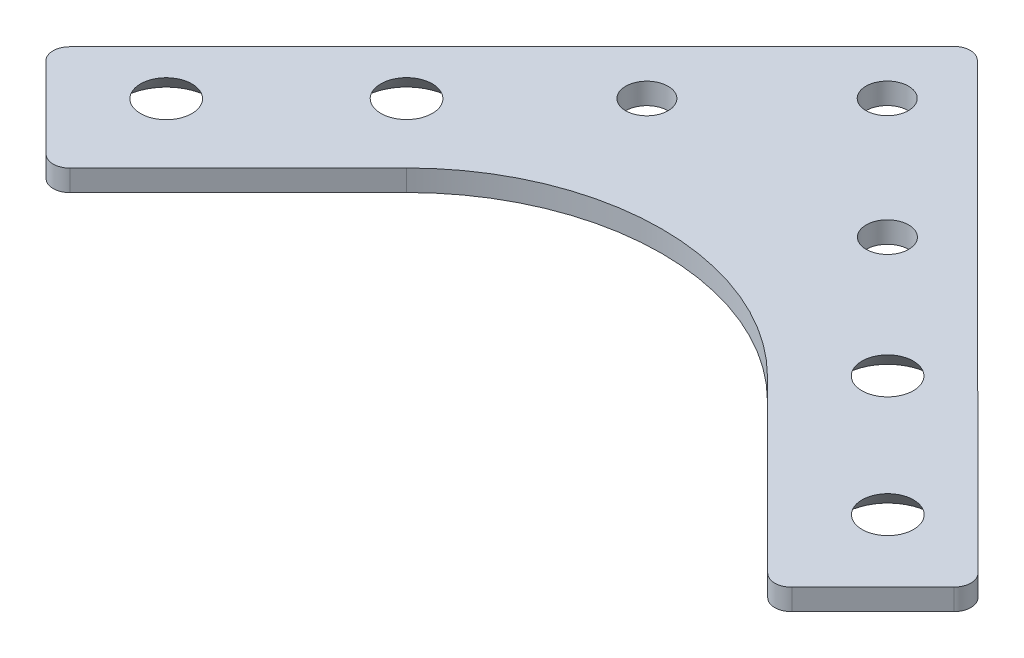
ISO-10303-21;
HEADER;
FILE_DESCRIPTION(('STEP AP214'),'2;1');
FILE_NAME('part.step','',(''),(''),'','','');
FILE_SCHEMA(('AUTOMOTIVE_DESIGN { 1 0 10303 214 1 1 1 1 }'));
ENDSEC;
DATA;
#1=APPLICATION_CONTEXT('core data for automotive mechanical design processes');
#2=APPLICATION_PROTOCOL_DEFINITION('international standard','automotive_design',2000,#1);
#3=PRODUCT_CONTEXT('',#1,'mechanical');
#4=PRODUCT('Part','Part','',(#3));
#5=PRODUCT_RELATED_PRODUCT_CATEGORY('part','',(#4));
#6=PRODUCT_DEFINITION_FORMATION('','',#4);
#7=PRODUCT_DEFINITION_CONTEXT('part definition',#1,'design');
#8=PRODUCT_DEFINITION('design','',#6,#7);
#9=PRODUCT_DEFINITION_SHAPE('','',#8);
#10=(LENGTH_UNIT() NAMED_UNIT(*) SI_UNIT(.MILLI.,.METRE.));
#11=(NAMED_UNIT(*) PLANE_ANGLE_UNIT() SI_UNIT($,.RADIAN.));
#12=(NAMED_UNIT(*) SI_UNIT($,.STERADIAN.) SOLID_ANGLE_UNIT());
#13=UNCERTAINTY_MEASURE_WITH_UNIT(LENGTH_MEASURE(1.E-05),#10,'distance_accuracy_value','');
#14=(GEOMETRIC_REPRESENTATION_CONTEXT(3) GLOBAL_UNCERTAINTY_ASSIGNED_CONTEXT((#13)) GLOBAL_UNIT_ASSIGNED_CONTEXT((#10,
#11,#12)) REPRESENTATION_CONTEXT('',''));
#15=CARTESIAN_POINT('',(0.,0.,0.));
#16=DIRECTION('',(0.,0.,1.));
#17=DIRECTION('',(1.,0.,0.));
#18=AXIS2_PLACEMENT_3D('',#15,#16,#17);
#19=CARTESIAN_POINT('',(175.177811216833,43.8333628767299,-652.315866193784));
#20=DIRECTION('',(0.,1.,0.));
#21=DIRECTION('',(-1.,0.,0.));
#22=AXIS2_PLACEMENT_3D('',#19,#20,#21);
#23=PLANE('',#22);
#24=CARTESIAN_POINT('',(139.293069628941,43.8333628767299,-606.488126001078));
#25=DIRECTION('',(0.,1.,0.));
#26=DIRECTION('',(-1.,0.,0.));
#27=AXIS2_PLACEMENT_3D('',#24,#25,#26);
#28=CIRCLE('',#27,3.84401460743349);
#29=CARTESIAN_POINT('',(135.449055021507,43.8333628767299,-606.488126001078));
#30=VERTEX_POINT('',#29);
#31=EDGE_CURVE('E41',#30,#30,#28,.T.);
#32=ORIENTED_EDGE('',*,*,#31,.F.);
#33=EDGE_LOOP('',(#32));
#34=FACE_BOUND('',#33,.T.);
#35=CARTESIAN_POINT('',(175.185634509855,43.8333628767299,-642.437587558512));
#36=DIRECTION('',(0.,-1.,0.));
#37=DIRECTION('',(0.,0.,-1.));
#38=AXIS2_PLACEMENT_3D('',#35,#36,#37);
#39=CIRCLE('',#38,3.17499999999998);
#40=CARTESIAN_POINT('',(175.185634509855,43.8333628767299,-645.612587558512));
#41=VERTEX_POINT('',#40);
#42=EDGE_CURVE('E236',#41,#41,#39,.T.);
#43=ORIENTED_EDGE('',*,*,#42,.T.);
#44=EDGE_LOOP('',(#43));
#45=FACE_BOUND('',#44,.T.);
#46=CARTESIAN_POINT('',(193.160365288572,43.8333628767299,-624.491305118054));
#47=DIRECTION('',(0.,-1.,0.));
#48=DIRECTION('',(0.,0.,-1.));
#49=AXIS2_PLACEMENT_3D('',#46,#47,#48);
#50=CIRCLE('',#49,3.17499999999998);
#51=CARTESIAN_POINT('',(193.160365288572,43.8333628767299,-627.666305118054));
#52=VERTEX_POINT('',#51);
#53=EDGE_CURVE('E242',#52,#52,#50,.T.);
#54=ORIENTED_EDGE('',*,*,#53,.T.);
#55=EDGE_LOOP('',(#54));
#56=FACE_BOUND('',#55,.T.);
#57=CARTESIAN_POINT('',(157.239352069398,43.8333628767299,-624.462856779795));
#58=DIRECTION('',(0.,-1.,0.));
#59=DIRECTION('',(0.,0.,-1.));
#60=AXIS2_PLACEMENT_3D('',#57,#58,#59);
#61=CIRCLE('',#60,3.17499999999998);
#62=CARTESIAN_POINT('',(157.239352069398,43.8333628767299,-627.637856779795));
#63=VERTEX_POINT('',#62);
#64=EDGE_CURVE('E162',#63,#63,#61,.T.);
#65=ORIENTED_EDGE('',*,*,#64,.T.);
#66=EDGE_LOOP('',(#65));
#67=FACE_BOUND('',#66,.T.);
#68=CARTESIAN_POINT('',(175.177811216833,43.8333628767299,-652.315866193784));
#69=DIRECTION('',(0.,1.,0.));
#70=DIRECTION('',(-1.,0.,0.));
#71=AXIS2_PLACEMENT_3D('',#68,#69,#70);
#72=CIRCLE('',#71,2.53999999999991);
#73=CARTESIAN_POINT('',(176.972439460879,43.8333628767299,-654.113339271656));
#74=VERTEX_POINT('',#73);
#75=CARTESIAN_POINT('',(173.380338138962,43.8333628767299,-654.11049443783));
#76=VERTEX_POINT('',#75);
#77=EDGE_CURVE('E158',#74,#76,#72,.T.);
#78=ORIENTED_EDGE('',*,*,#77,.T.);
#79=DIRECTION('',(0.706546552773901,0.,-0.707666566091204));
#80=VECTOR('',#79,1.);
#81=CARTESIAN_POINT('',(107.427750170282,43.8333628767299,-588.053358826047));
#82=LINE('',#81,#80);
#83=CARTESIAN_POINT('',(107.427750170282,43.8333628767299,-588.053358826047));
#84=VERTEX_POINT('',#83);
#85=EDGE_CURVE('E161',#84,#76,#82,.T.);
#86=ORIENTED_EDGE('',*,*,#85,.F.);
#87=CARTESIAN_POINT('',(109.225223248154,43.8333628767299,-586.258730582001));
#88=DIRECTION('',(0.,-1.,0.));
#89=DIRECTION('',(1.,0.,0.));
#90=AXIS2_PLACEMENT_3D('',#87,#88,#89);
#91=CIRCLE('',#90,2.54000000000001);
#92=CARTESIAN_POINT('',(107.430595004108,43.8333628767299,-584.461257504129));
#93=VERTEX_POINT('',#92);
#94=EDGE_CURVE('E165',#93,#84,#91,.T.);
#95=ORIENTED_EDGE('',*,*,#94,.F.);
#96=DIRECTION('',(0.707666566091211,0.,0.706546552773894));
#97=VECTOR('',#96,1.);
#98=CARTESIAN_POINT('',(107.430595004108,43.8333628767299,-584.461257504129));
#99=LINE('',#98,#97);
#100=CARTESIAN_POINT('',(119.563538279742,43.8333628767299,-572.347516856821));
#101=VERTEX_POINT('',#100);
#102=EDGE_CURVE('E167',#93,#101,#99,.T.);
#103=ORIENTED_EDGE('',*,*,#102,.T.);
#104=CARTESIAN_POINT('',(121.358166523788,43.8333628767299,-574.144989934692));
#105=DIRECTION('',(0.,1.,0.));
#106=DIRECTION('',(-1.,0.,0.));
#107=AXIS2_PLACEMENT_3D('',#104,#105,#106);
#108=CIRCLE('',#107,2.53999999999996);
#109=CARTESIAN_POINT('',(123.15563960166,43.8333628767299,-572.350361690647));
#110=VERTEX_POINT('',#109);
#111=EDGE_CURVE('E170',#101,#110,#108,.T.);
#112=ORIENTED_EDGE('',*,*,#111,.T.);
#113=DIRECTION('',(-0.706546552773895,0.,0.70766656609121));
#114=VECTOR('',#113,1.);
#115=CARTESIAN_POINT('',(148.280435018299,43.8333628767299,-597.51498478085));
#116=LINE('',#115,#114);
#117=CARTESIAN_POINT('',(148.280435018299,43.8333628767299,-597.51498478085));
#118=VERTEX_POINT('',#117);
#119=EDGE_CURVE('E173',#118,#110,#116,.T.);
#120=ORIENTED_EDGE('',*,*,#119,.F.);
#121=CARTESIAN_POINT('',(175.242531186374,43.8333628767299,-570.595561120164));
#122=DIRECTION('',(0.,1.,0.));
#123=DIRECTION('',(-1.,0.,0.));
#124=AXIS2_PLACEMENT_3D('',#121,#122,#123);
#125=CIRCLE('',#124,38.1);
#126=CARTESIAN_POINT('',(202.16195484706,43.8333628767299,-597.557657288239));
#127=VERTEX_POINT('',#126);
#128=EDGE_CURVE('E176',#127,#118,#125,.T.);
#129=ORIENTED_EDGE('',*,*,#128,.F.);
#130=DIRECTION('',(-0.70766656609121,0.,-0.706546552773896));
#131=VECTOR('',#130,1.);
#132=CARTESIAN_POINT('',(227.727905917185,43.8333628767299,-572.032169067485));
#133=LINE('',#132,#131);
#134=CARTESIAN_POINT('',(227.727905917185,43.8333628767299,-572.032169067485));
#135=VERTEX_POINT('',#134);
#136=EDGE_CURVE('E178',#135,#127,#133,.T.);
#137=ORIENTED_EDGE('',*,*,#136,.F.);
#138=CARTESIAN_POINT('',(229.52253416123,43.8333628767299,-573.829642145356));
#139=DIRECTION('',(0.,-1.,0.));
#140=DIRECTION('',(1.,0.,0.));
#141=AXIS2_PLACEMENT_3D('',#138,#139,#140);
#142=CIRCLE('',#141,2.53999999999996);
#143=CARTESIAN_POINT('',(231.320007239102,43.8333628767299,-572.035013901311));
#144=VERTEX_POINT('',#143);
#145=EDGE_CURVE('E180',#144,#135,#142,.T.);
#146=ORIENTED_EDGE('',*,*,#145,.F.);
#147=DIRECTION('',(-0.706546552773897,0.,0.707666566091208));
#148=VECTOR('',#147,1.);
#149=CARTESIAN_POINT('',(243.43374788641,43.8333628767299,-584.167957176944));
#150=LINE('',#149,#148);
#151=CARTESIAN_POINT('',(243.43374788641,43.8333628767299,-584.167957176944));
#152=VERTEX_POINT('',#151);
#153=EDGE_CURVE('E182',#152,#144,#150,.T.);
#154=ORIENTED_EDGE('',*,*,#153,.F.);
#155=CARTESIAN_POINT('',(241.636274808538,43.8333628767299,-585.96258542099));
#156=DIRECTION('',(0.,1.,0.));
#157=DIRECTION('',(-1.,0.,0.));
#158=AXIS2_PLACEMENT_3D('',#155,#156,#157);
#159=CIRCLE('',#158,2.54000000000002);
#160=CARTESIAN_POINT('',(243.430903052584,43.8333628767299,-587.760058498861));
#161=VERTEX_POINT('',#160);
#162=EDGE_CURVE('E138',#152,#161,#159,.T.);
#163=ORIENTED_EDGE('',*,*,#162,.T.);
#164=DIRECTION('',(0.707666566091204,0.,0.706546552773901));
#165=VECTOR('',#164,1.);
#166=CARTESIAN_POINT('',(176.972439460879,43.8333628767299,-654.113339271656));
#167=LINE('',#166,#165);
#168=EDGE_CURVE('E185',#74,#161,#167,.T.);
#169=ORIENTED_EDGE('',*,*,#168,.F.);
#170=EDGE_LOOP('',(#78,#86,#95,#103,#112,#120,#129,#137,#146,#154,#163,#169));
#171=FACE_BOUND('',#170,.T.);
#172=CARTESIAN_POINT('',(229.109826846005,43.8333628767299,-588.598740237141));
#173=DIRECTION('',(0.,1.,0.));
#174=DIRECTION('',(-1.,0.,0.));
#175=AXIS2_PLACEMENT_3D('',#172,#173,#174);
#176=CIRCLE('',#175,3.84401460743349);
#177=CARTESIAN_POINT('',(225.265812238571,43.8333628767299,-588.598740237141));
#178=VERTEX_POINT('',#177);
#179=EDGE_CURVE('E209',#178,#178,#176,.T.);
#180=ORIENTED_EDGE('',*,*,#179,.F.);
#181=EDGE_LOOP('',(#180));
#182=FACE_BOUND('',#181,.T.);
#183=CARTESIAN_POINT('',(211.135096067288,43.8333628767299,-606.545022677597));
#184=DIRECTION('',(0.,1.,0.));
#185=DIRECTION('',(-1.,0.,0.));
#186=AXIS2_PLACEMENT_3D('',#183,#184,#185);
#187=CIRCLE('',#186,3.84401460743349);
#188=CARTESIAN_POINT('',(207.291081459855,43.8333628767299,-606.545022677597));
#189=VERTEX_POINT('',#188);
#190=EDGE_CURVE('E214',#189,#189,#187,.T.);
#191=ORIENTED_EDGE('',*,*,#190,.F.);
#192=EDGE_LOOP('',(#191));
#193=FACE_BOUND('',#192,.T.);
#194=CARTESIAN_POINT('',(121.346787188484,43.8333628767299,-588.513395222362));
#195=DIRECTION('',(0.,1.,0.));
#196=DIRECTION('',(-1.,0.,0.));
#197=AXIS2_PLACEMENT_3D('',#194,#195,#196);
#198=CIRCLE('',#197,3.84401460743348);
#199=CARTESIAN_POINT('',(117.50277258105,43.8333628767299,-588.513395222362));
#200=VERTEX_POINT('',#199);
#201=EDGE_CURVE('E217',#200,#200,#198,.T.);
#202=ORIENTED_EDGE('',*,*,#201,.F.);
#203=EDGE_LOOP('',(#202));
#204=FACE_BOUND('',#203,.T.);
#205=ADVANCED_FACE('F37',(#34,#45,#56,#67,#171,#182,#193,#204),#23,.T.);
#206=CARTESIAN_POINT('',(175.177811216833,40.6583628767299,-652.315866193784));
#207=DIRECTION('',(0.,1.,0.));
#208=DIRECTION('',(-1.,0.,0.));
#209=AXIS2_PLACEMENT_3D('',#206,#207,#208);
#210=PLANE('',#209);
#211=CARTESIAN_POINT('',(139.293069628941,40.6583628767299,-606.488126001078));
#212=DIRECTION('',(0.,-1.,0.));
#213=DIRECTION('',(0.,0.,-1.));
#214=AXIS2_PLACEMENT_3D('',#211,#212,#213);
#215=CIRCLE('',#214,6.604);
#216=CARTESIAN_POINT('',(139.293069628941,40.6583628767299,-613.092126001078));
#217=VERTEX_POINT('',#216);
#218=EDGE_CURVE('E229',#217,#217,#215,.T.);
#219=ORIENTED_EDGE('',*,*,#218,.F.);
#220=EDGE_LOOP('',(#219));
#221=FACE_BOUND('',#220,.T.);
#222=CARTESIAN_POINT('',(121.346787188484,40.6583628767299,-588.513395222362));
#223=DIRECTION('',(0.,-1.,0.));
#224=DIRECTION('',(0.,0.,-1.));
#225=AXIS2_PLACEMENT_3D('',#222,#223,#224);
#226=CIRCLE('',#225,6.604);
#227=CARTESIAN_POINT('',(121.346787188484,40.6583628767299,-595.117395222362));
#228=VERTEX_POINT('',#227);
#229=EDGE_CURVE('E219',#228,#228,#226,.T.);
#230=ORIENTED_EDGE('',*,*,#229,.F.);
#231=EDGE_LOOP('',(#230));
#232=FACE_BOUND('',#231,.T.);
#233=CARTESIAN_POINT('',(229.109826846005,40.6583628767299,-588.598740237141));
#234=DIRECTION('',(0.,-1.,0.));
#235=DIRECTION('',(0.,0.,-1.));
#236=AXIS2_PLACEMENT_3D('',#233,#234,#235);
#237=CIRCLE('',#236,6.604);
#238=CARTESIAN_POINT('',(229.109826846005,40.6583628767299,-595.20274023714));
#239=VERTEX_POINT('',#238);
#240=EDGE_CURVE('E213',#239,#239,#237,.T.);
#241=ORIENTED_EDGE('',*,*,#240,.F.);
#242=EDGE_LOOP('',(#241));
#243=FACE_BOUND('',#242,.T.);
#244=CARTESIAN_POINT('',(175.185634509855,40.6583628767299,-642.437587558512));
#245=DIRECTION('',(0.,-1.,0.));
#246=DIRECTION('',(0.,0.,-1.));
#247=AXIS2_PLACEMENT_3D('',#244,#245,#246);
#248=CIRCLE('',#247,3.17499999999998);
#249=CARTESIAN_POINT('',(175.185634509855,40.6583628767299,-645.612587558512));
#250=VERTEX_POINT('',#249);
#251=EDGE_CURVE('E212',#250,#250,#248,.T.);
#252=ORIENTED_EDGE('',*,*,#251,.F.);
#253=EDGE_LOOP('',(#252));
#254=FACE_BOUND('',#253,.T.);
#255=CARTESIAN_POINT('',(193.160365288572,40.6583628767299,-624.491305118054));
#256=DIRECTION('',(0.,-1.,0.));
#257=DIRECTION('',(0.,0.,-1.));
#258=AXIS2_PLACEMENT_3D('',#255,#256,#257);
#259=CIRCLE('',#258,3.17499999999998);
#260=CARTESIAN_POINT('',(193.160365288572,40.6583628767299,-627.666305118054));
#261=VERTEX_POINT('',#260);
#262=EDGE_CURVE('E239',#261,#261,#259,.T.);
#263=ORIENTED_EDGE('',*,*,#262,.F.);
#264=EDGE_LOOP('',(#263));
#265=FACE_BOUND('',#264,.T.);
#266=CARTESIAN_POINT('',(157.239352069398,40.6583628767299,-624.462856779795));
#267=DIRECTION('',(0.,-1.,0.));
#268=DIRECTION('',(0.,0.,-1.));
#269=AXIS2_PLACEMENT_3D('',#266,#267,#268);
#270=CIRCLE('',#269,3.17499999999998);
#271=CARTESIAN_POINT('',(157.239352069398,40.6583628767299,-627.637856779795));
#272=VERTEX_POINT('',#271);
#273=EDGE_CURVE('E245',#272,#272,#270,.T.);
#274=ORIENTED_EDGE('',*,*,#273,.F.);
#275=EDGE_LOOP('',(#274));
#276=FACE_BOUND('',#275,.T.);
#277=CARTESIAN_POINT('',(175.177811216833,40.6583628767299,-652.315866193784));
#278=DIRECTION('',(0.,1.,0.));
#279=DIRECTION('',(-1.,0.,0.));
#280=AXIS2_PLACEMENT_3D('',#277,#278,#279);
#281=CIRCLE('',#280,2.53999999999991);
#282=CARTESIAN_POINT('',(176.972439460879,40.6583628767299,-654.113339271656));
#283=VERTEX_POINT('',#282);
#284=CARTESIAN_POINT('',(173.380338138962,40.6583628767299,-654.11049443783));
#285=VERTEX_POINT('',#284);
#286=EDGE_CURVE('E186',#283,#285,#281,.T.);
#287=ORIENTED_EDGE('',*,*,#286,.F.);
#288=DIRECTION('',(0.707666566091204,0.,0.706546552773901));
#289=VECTOR('',#288,1.);
#290=CARTESIAN_POINT('',(176.972439460879,40.6583628767299,-654.113339271656));
#291=LINE('',#290,#289);
#292=CARTESIAN_POINT('',(243.430903052584,40.6583628767299,-587.760058498861));
#293=VERTEX_POINT('',#292);
#294=EDGE_CURVE('E152',#283,#293,#291,.T.);
#295=ORIENTED_EDGE('',*,*,#294,.T.);
#296=CARTESIAN_POINT('',(241.636274808538,40.6583628767299,-585.96258542099));
#297=DIRECTION('',(0.,1.,0.));
#298=DIRECTION('',(-1.,0.,0.));
#299=AXIS2_PLACEMENT_3D('',#296,#297,#298);
#300=CIRCLE('',#299,2.54000000000002);
#301=CARTESIAN_POINT('',(243.43374788641,40.6583628767299,-584.167957176944));
#302=VERTEX_POINT('',#301);
#303=EDGE_CURVE('E136',#302,#293,#300,.T.);
#304=ORIENTED_EDGE('',*,*,#303,.F.);
#305=DIRECTION('',(-0.706546552773897,0.,0.707666566091208));
#306=VECTOR('',#305,1.);
#307=CARTESIAN_POINT('',(243.43374788641,40.6583628767299,-584.167957176944));
#308=LINE('',#307,#306);
#309=CARTESIAN_POINT('',(231.320007239102,40.6583628767299,-572.035013901311));
#310=VERTEX_POINT('',#309);
#311=EDGE_CURVE('E144',#302,#310,#308,.T.);
#312=ORIENTED_EDGE('',*,*,#311,.T.);
#313=CARTESIAN_POINT('',(229.52253416123,40.6583628767299,-573.829642145356));
#314=DIRECTION('',(0.,-1.,0.));
#315=DIRECTION('',(1.,0.,0.));
#316=AXIS2_PLACEMENT_3D('',#313,#314,#315);
#317=CIRCLE('',#316,2.53999999999996);
#318=CARTESIAN_POINT('',(227.727905917185,40.6583628767299,-572.032169067485));
#319=VERTEX_POINT('',#318);
#320=EDGE_CURVE('E148',#310,#319,#317,.T.);
#321=ORIENTED_EDGE('',*,*,#320,.T.);
#322=DIRECTION('',(-0.70766656609121,0.,-0.706546552773896));
#323=VECTOR('',#322,1.);
#324=CARTESIAN_POINT('',(227.727905917185,40.6583628767299,-572.032169067485));
#325=LINE('',#324,#323);
#326=CARTESIAN_POINT('',(202.16195484706,40.6583628767299,-597.557657288239));
#327=VERTEX_POINT('',#326);
#328=EDGE_CURVE('E264',#319,#327,#325,.T.);
#329=ORIENTED_EDGE('',*,*,#328,.T.);
#330=CARTESIAN_POINT('',(175.242531186374,40.6583628767299,-570.595561120164));
#331=DIRECTION('',(0.,1.,0.));
#332=DIRECTION('',(-1.,0.,0.));
#333=AXIS2_PLACEMENT_3D('',#330,#331,#332);
#334=CIRCLE('',#333,38.1);
#335=CARTESIAN_POINT('',(148.280435018299,40.6583628767299,-597.51498478085));
#336=VERTEX_POINT('',#335);
#337=EDGE_CURVE('E262',#327,#336,#334,.T.);
#338=ORIENTED_EDGE('',*,*,#337,.T.);
#339=DIRECTION('',(-0.706546552773895,0.,0.70766656609121));
#340=VECTOR('',#339,1.);
#341=CARTESIAN_POINT('',(148.280435018299,40.6583628767299,-597.51498478085));
#342=LINE('',#341,#340);
#343=CARTESIAN_POINT('',(123.15563960166,40.6583628767299,-572.350361690647));
#344=VERTEX_POINT('',#343);
#345=EDGE_CURVE('E260',#336,#344,#342,.T.);
#346=ORIENTED_EDGE('',*,*,#345,.T.);
#347=CARTESIAN_POINT('',(121.358166523788,40.6583628767299,-574.144989934692));
#348=DIRECTION('',(0.,1.,0.));
#349=DIRECTION('',(-1.,0.,0.));
#350=AXIS2_PLACEMENT_3D('',#347,#348,#349);
#351=CIRCLE('',#350,2.53999999999996);
#352=CARTESIAN_POINT('',(119.563538279742,40.6583628767299,-572.347516856821));
#353=VERTEX_POINT('',#352);
#354=EDGE_CURVE('E257',#353,#344,#351,.T.);
#355=ORIENTED_EDGE('',*,*,#354,.F.);
#356=DIRECTION('',(0.707666566091211,0.,0.706546552773894));
#357=VECTOR('',#356,1.);
#358=CARTESIAN_POINT('',(107.430595004108,40.6583628767299,-584.461257504129));
#359=LINE('',#358,#357);
#360=CARTESIAN_POINT('',(107.430595004108,40.6583628767299,-584.461257504129));
#361=VERTEX_POINT('',#360);
#362=EDGE_CURVE('E254',#361,#353,#359,.T.);
#363=ORIENTED_EDGE('',*,*,#362,.F.);
#364=CARTESIAN_POINT('',(109.225223248154,40.6583628767299,-586.258730582001));
#365=DIRECTION('',(0.,-1.,0.));
#366=DIRECTION('',(1.,0.,0.));
#367=AXIS2_PLACEMENT_3D('',#364,#365,#366);
#368=CIRCLE('',#367,2.54000000000001);
#369=CARTESIAN_POINT('',(107.427750170282,40.6583628767299,-588.053358826047));
#370=VERTEX_POINT('',#369);
#371=EDGE_CURVE('E252',#361,#370,#368,.T.);
#372=ORIENTED_EDGE('',*,*,#371,.T.);
#373=DIRECTION('',(0.706546552773901,0.,-0.707666566091204));
#374=VECTOR('',#373,1.);
#375=CARTESIAN_POINT('',(107.427750170282,40.6583628767299,-588.053358826047));
#376=LINE('',#375,#374);
#377=EDGE_CURVE('E107',#370,#285,#376,.T.);
#378=ORIENTED_EDGE('',*,*,#377,.T.);
#379=EDGE_LOOP('',(#287,#295,#304,#312,#321,#329,#338,#346,#355,#363,#372,#378));
#380=FACE_BOUND('',#379,.T.);
#381=CARTESIAN_POINT('',(211.135096067288,40.6583628767299,-606.545022677597));
#382=DIRECTION('',(0.,-1.,0.));
#383=DIRECTION('',(0.,0.,-1.));
#384=AXIS2_PLACEMENT_3D('',#381,#382,#383);
#385=CIRCLE('',#384,6.604);
#386=CARTESIAN_POINT('',(211.135096067288,40.6583628767299,-613.149022677597));
#387=VERTEX_POINT('',#386);
#388=EDGE_CURVE('E216',#387,#387,#385,.T.);
#389=ORIENTED_EDGE('',*,*,#388,.F.);
#390=EDGE_LOOP('',(#389));
#391=FACE_BOUND('',#390,.T.);
#392=ADVANCED_FACE('F150',(#221,#232,#243,#254,#265,#276,#380,#391),#210,.F.);
#393=CARTESIAN_POINT('',(175.177811216833,40.6583628767299,-652.315866193784));
#394=DIRECTION('',(0.,1.,0.));
#395=DIRECTION('',(-1.,0.,0.));
#396=AXIS2_PLACEMENT_3D('',#393,#394,#395);
#397=CYLINDRICAL_SURFACE('',#396,2.53999999999991);
#398=ORIENTED_EDGE('',*,*,#77,.F.);
#399=DIRECTION('',(0.,1.,0.));
#400=VECTOR('',#399,1.);
#401=CARTESIAN_POINT('',(176.972439460879,40.6583628767299,-654.113339271656));
#402=LINE('',#401,#400);
#403=EDGE_CURVE('E11',#283,#74,#402,.T.);
#404=ORIENTED_EDGE('',*,*,#403,.F.);
#405=ORIENTED_EDGE('',*,*,#286,.T.);
#406=DIRECTION('',(0.,1.,0.));
#407=VECTOR('',#406,1.);
#408=CARTESIAN_POINT('',(173.380338138962,40.6583628767299,-654.11049443783));
#409=LINE('',#408,#407);
#410=EDGE_CURVE('E154',#285,#76,#409,.T.);
#411=ORIENTED_EDGE('',*,*,#410,.T.);
#412=EDGE_LOOP('',(#398,#404,#405,#411));
#413=FACE_BOUND('',#412,.T.);
#414=ADVANCED_FACE('F39',(#413),#397,.T.);
#415=CARTESIAN_POINT('',(176.972439460879,40.6583628767299,-654.113339271656));
#416=DIRECTION('',(-0.706546552773901,0.,0.707666566091204));
#417=DIRECTION('',(0.707666566091204,0.,0.706546552773901));
#418=AXIS2_PLACEMENT_3D('',#415,#416,#417);
#419=PLANE('',#418);
#420=ORIENTED_EDGE('',*,*,#168,.T.);
#421=DIRECTION('',(0.,1.,0.));
#422=VECTOR('',#421,1.);
#423=CARTESIAN_POINT('',(243.430903052584,40.6583628767299,-587.760058498861));
#424=LINE('',#423,#422);
#425=EDGE_CURVE('E47',#293,#161,#424,.T.);
#426=ORIENTED_EDGE('',*,*,#425,.F.);
#427=ORIENTED_EDGE('',*,*,#294,.F.);
#428=ORIENTED_EDGE('',*,*,#403,.T.);
#429=EDGE_LOOP('',(#420,#426,#427,#428));
#430=FACE_BOUND('',#429,.T.);
#431=ADVANCED_FACE('F301',(#430),#419,.F.);
#432=CARTESIAN_POINT('',(241.636274808538,40.6583628767299,-585.96258542099));
#433=DIRECTION('',(0.,1.,0.));
#434=DIRECTION('',(-1.,0.,0.));
#435=AXIS2_PLACEMENT_3D('',#432,#433,#434);
#436=CYLINDRICAL_SURFACE('',#435,2.54000000000002);
#437=ORIENTED_EDGE('',*,*,#162,.F.);
#438=DIRECTION('',(0.,1.,0.));
#439=VECTOR('',#438,1.);
#440=CARTESIAN_POINT('',(243.43374788641,40.6583628767299,-584.167957176944));
#441=LINE('',#440,#439);
#442=EDGE_CURVE('E132',#302,#152,#441,.T.);
#443=ORIENTED_EDGE('',*,*,#442,.F.);
#444=ORIENTED_EDGE('',*,*,#303,.T.);
#445=ORIENTED_EDGE('',*,*,#425,.T.);
#446=EDGE_LOOP('',(#437,#443,#444,#445));
#447=FACE_BOUND('',#446,.T.);
#448=ADVANCED_FACE('F134',(#447),#436,.T.);
#449=CARTESIAN_POINT('',(243.43374788641,40.6583628767299,-584.167957176944));
#450=DIRECTION('',(-0.707666566091208,0.,-0.706546552773897));
#451=DIRECTION('',(-0.706546552773897,0.,0.707666566091208));
#452=AXIS2_PLACEMENT_3D('',#449,#450,#451);
#453=PLANE('',#452);
#454=ORIENTED_EDGE('',*,*,#153,.T.);
#455=DIRECTION('',(0.,1.,0.));
#456=VECTOR('',#455,1.);
#457=CARTESIAN_POINT('',(231.320007239102,40.6583628767299,-572.035013901311));
#458=LINE('',#457,#456);
#459=EDGE_CURVE('E141',#310,#144,#458,.T.);
#460=ORIENTED_EDGE('',*,*,#459,.F.);
#461=ORIENTED_EDGE('',*,*,#311,.F.);
#462=ORIENTED_EDGE('',*,*,#442,.T.);
#463=EDGE_LOOP('',(#454,#460,#461,#462));
#464=FACE_BOUND('',#463,.T.);
#465=ADVANCED_FACE('F145',(#464),#453,.F.);
#466=CARTESIAN_POINT('',(229.52253416123,40.6583628767299,-573.829642145356));
#467=DIRECTION('',(0.,1.,0.));
#468=DIRECTION('',(-1.,0.,0.));
#469=AXIS2_PLACEMENT_3D('',#466,#467,#468);
#470=CYLINDRICAL_SURFACE('',#469,2.53999999999996);
#471=ORIENTED_EDGE('',*,*,#145,.T.);
#472=DIRECTION('',(0.,1.,0.));
#473=VECTOR('',#472,1.);
#474=CARTESIAN_POINT('',(227.727905917185,40.6583628767299,-572.032169067485));
#475=LINE('',#474,#473);
#476=EDGE_CURVE('E190',#319,#135,#475,.T.);
#477=ORIENTED_EDGE('',*,*,#476,.F.);
#478=ORIENTED_EDGE('',*,*,#320,.F.);
#479=ORIENTED_EDGE('',*,*,#459,.T.);
#480=EDGE_LOOP('',(#471,#477,#478,#479));
#481=FACE_BOUND('',#480,.T.);
#482=ADVANCED_FACE('F269',(#481),#470,.T.);
#483=CARTESIAN_POINT('',(227.727905917185,40.6583628767299,-572.032169067485));
#484=DIRECTION('',(0.706546552773896,0.,-0.70766656609121));
#485=DIRECTION('',(-0.70766656609121,0.,-0.706546552773896));
#486=AXIS2_PLACEMENT_3D('',#483,#484,#485);
#487=PLANE('',#486);
#488=ORIENTED_EDGE('',*,*,#136,.T.);
#489=DIRECTION('',(0.,1.,0.));
#490=VECTOR('',#489,1.);
#491=CARTESIAN_POINT('',(202.16195484706,40.6583628767299,-597.557657288239));
#492=LINE('',#491,#490);
#493=EDGE_CURVE('E193',#327,#127,#492,.T.);
#494=ORIENTED_EDGE('',*,*,#493,.F.);
#495=ORIENTED_EDGE('',*,*,#328,.F.);
#496=ORIENTED_EDGE('',*,*,#476,.T.);
#497=EDGE_LOOP('',(#488,#494,#495,#496));
#498=FACE_BOUND('',#497,.T.);
#499=ADVANCED_FACE('F273',(#498),#487,.F.);
#500=CARTESIAN_POINT('',(175.242531186374,40.6583628767299,-570.595561120164));
#501=DIRECTION('',(0.,1.,0.));
#502=DIRECTION('',(-1.,0.,0.));
#503=AXIS2_PLACEMENT_3D('',#500,#501,#502);
#504=CYLINDRICAL_SURFACE('',#503,38.1);
#505=ORIENTED_EDGE('',*,*,#128,.T.);
#506=DIRECTION('',(0.,1.,0.));
#507=VECTOR('',#506,1.);
#508=CARTESIAN_POINT('',(148.280435018299,40.6583628767299,-597.51498478085));
#509=LINE('',#508,#507);
#510=EDGE_CURVE('E196',#336,#118,#509,.T.);
#511=ORIENTED_EDGE('',*,*,#510,.F.);
#512=ORIENTED_EDGE('',*,*,#337,.F.);
#513=ORIENTED_EDGE('',*,*,#493,.T.);
#514=EDGE_LOOP('',(#505,#511,#512,#513));
#515=FACE_BOUND('',#514,.T.);
#516=ADVANCED_FACE('F278',(#515),#504,.F.);
#517=CARTESIAN_POINT('',(148.280435018299,40.6583628767299,-597.51498478085));
#518=DIRECTION('',(-0.70766656609121,0.,-0.706546552773895));
#519=DIRECTION('',(-0.706546552773895,0.,0.70766656609121));
#520=AXIS2_PLACEMENT_3D('',#517,#518,#519);
#521=PLANE('',#520);
#522=ORIENTED_EDGE('',*,*,#119,.T.);
#523=DIRECTION('',(0.,1.,0.));
#524=VECTOR('',#523,1.);
#525=CARTESIAN_POINT('',(123.15563960166,40.6583628767299,-572.350361690647));
#526=LINE('',#525,#524);
#527=EDGE_CURVE('E199',#344,#110,#526,.T.);
#528=ORIENTED_EDGE('',*,*,#527,.F.);
#529=ORIENTED_EDGE('',*,*,#345,.F.);
#530=ORIENTED_EDGE('',*,*,#510,.T.);
#531=EDGE_LOOP('',(#522,#528,#529,#530));
#532=FACE_BOUND('',#531,.T.);
#533=ADVANCED_FACE('F284',(#532),#521,.F.);
#534=CARTESIAN_POINT('',(121.358166523788,40.6583628767299,-574.144989934692));
#535=DIRECTION('',(0.,1.,0.));
#536=DIRECTION('',(-1.,0.,0.));
#537=AXIS2_PLACEMENT_3D('',#534,#535,#536);
#538=CYLINDRICAL_SURFACE('',#537,2.53999999999996);
#539=ORIENTED_EDGE('',*,*,#111,.F.);
#540=DIRECTION('',(0.,1.,0.));
#541=VECTOR('',#540,1.);
#542=CARTESIAN_POINT('',(119.563538279742,40.6583628767299,-572.347516856821));
#543=LINE('',#542,#541);
#544=EDGE_CURVE('E201',#353,#101,#543,.T.);
#545=ORIENTED_EDGE('',*,*,#544,.F.);
#546=ORIENTED_EDGE('',*,*,#354,.T.);
#547=ORIENTED_EDGE('',*,*,#527,.T.);
#548=EDGE_LOOP('',(#539,#545,#546,#547));
#549=FACE_BOUND('',#548,.T.);
#550=ADVANCED_FACE('F288',(#549),#538,.T.);
#551=CARTESIAN_POINT('',(107.430595004108,40.6583628767299,-584.461257504129));
#552=DIRECTION('',(-0.706546552773894,0.,0.707666566091211));
#553=DIRECTION('',(0.707666566091211,0.,0.706546552773894));
#554=AXIS2_PLACEMENT_3D('',#551,#552,#553);
#555=PLANE('',#554);
#556=ORIENTED_EDGE('',*,*,#102,.F.);
#557=DIRECTION('',(0.,1.,0.));
#558=VECTOR('',#557,1.);
#559=CARTESIAN_POINT('',(107.430595004108,40.6583628767299,-584.461257504129));
#560=LINE('',#559,#558);
#561=EDGE_CURVE('E203',#361,#93,#560,.T.);
#562=ORIENTED_EDGE('',*,*,#561,.F.);
#563=ORIENTED_EDGE('',*,*,#362,.T.);
#564=ORIENTED_EDGE('',*,*,#544,.T.);
#565=EDGE_LOOP('',(#556,#562,#563,#564));
#566=FACE_BOUND('',#565,.T.);
#567=ADVANCED_FACE('F291',(#566),#555,.T.);
#568=CARTESIAN_POINT('',(109.225223248154,40.6583628767299,-586.258730582001));
#569=DIRECTION('',(0.,1.,0.));
#570=DIRECTION('',(-1.,0.,0.));
#571=AXIS2_PLACEMENT_3D('',#568,#569,#570);
#572=CYLINDRICAL_SURFACE('',#571,2.54000000000001);
#573=ORIENTED_EDGE('',*,*,#94,.T.);
#574=DIRECTION('',(0.,1.,0.));
#575=VECTOR('',#574,1.);
#576=CARTESIAN_POINT('',(107.427750170282,40.6583628767299,-588.053358826047));
#577=LINE('',#576,#575);
#578=EDGE_CURVE('E205',#370,#84,#577,.T.);
#579=ORIENTED_EDGE('',*,*,#578,.F.);
#580=ORIENTED_EDGE('',*,*,#371,.F.);
#581=ORIENTED_EDGE('',*,*,#561,.T.);
#582=EDGE_LOOP('',(#573,#579,#580,#581));
#583=FACE_BOUND('',#582,.T.);
#584=ADVANCED_FACE('F295',(#583),#572,.T.);
#585=CARTESIAN_POINT('',(107.427750170282,40.6583628767299,-588.053358826047));
#586=DIRECTION('',(0.707666566091204,0.,0.706546552773901));
#587=DIRECTION('',(0.706546552773901,0.,-0.707666566091204));
#588=AXIS2_PLACEMENT_3D('',#585,#586,#587);
#589=PLANE('',#588);
#590=ORIENTED_EDGE('',*,*,#85,.T.);
#591=ORIENTED_EDGE('',*,*,#410,.F.);
#592=ORIENTED_EDGE('',*,*,#377,.F.);
#593=ORIENTED_EDGE('',*,*,#578,.T.);
#594=EDGE_LOOP('',(#590,#591,#592,#593));
#595=FACE_BOUND('',#594,.T.);
#596=ADVANCED_FACE('F299',(#595),#589,.F.);
#597=CARTESIAN_POINT('',(157.239352069398,40.6583628767299,-624.462856779795));
#598=DIRECTION('',(0.,-1.,0.));
#599=DIRECTION('',(0.,0.,-1.));
#600=AXIS2_PLACEMENT_3D('',#597,#598,#599);
#601=CYLINDRICAL_SURFACE('',#600,3.17499999999998);
#602=ORIENTED_EDGE('',*,*,#64,.F.);
#603=EDGE_LOOP('',(#602));
#604=FACE_BOUND('',#603,.T.);
#605=ORIENTED_EDGE('',*,*,#273,.T.);
#606=EDGE_LOOP('',(#605));
#607=FACE_BOUND('',#606,.T.);
#608=ADVANCED_FACE('F336',(#604,#607),#601,.F.);
#609=CARTESIAN_POINT('',(193.160365288572,40.6583628767299,-624.491305118054));
#610=DIRECTION('',(0.,-1.,0.));
#611=DIRECTION('',(0.,0.,-1.));
#612=AXIS2_PLACEMENT_3D('',#609,#610,#611);
#613=CYLINDRICAL_SURFACE('',#612,3.17499999999998);
#614=ORIENTED_EDGE('',*,*,#53,.F.);
#615=EDGE_LOOP('',(#614));
#616=FACE_BOUND('',#615,.T.);
#617=ORIENTED_EDGE('',*,*,#262,.T.);
#618=EDGE_LOOP('',(#617));
#619=FACE_BOUND('',#618,.T.);
#620=ADVANCED_FACE('F340',(#616,#619),#613,.F.);
#621=CARTESIAN_POINT('',(175.185634509855,40.6583628767299,-642.437587558512));
#622=DIRECTION('',(0.,-1.,0.));
#623=DIRECTION('',(0.,0.,-1.));
#624=AXIS2_PLACEMENT_3D('',#621,#622,#623);
#625=CYLINDRICAL_SURFACE('',#624,3.17499999999998);
#626=ORIENTED_EDGE('',*,*,#42,.F.);
#627=EDGE_LOOP('',(#626));
#628=FACE_BOUND('',#627,.T.);
#629=ORIENTED_EDGE('',*,*,#251,.T.);
#630=EDGE_LOOP('',(#629));
#631=FACE_BOUND('',#630,.T.);
#632=ADVANCED_FACE('F345',(#628,#631),#625,.F.);
#633=CARTESIAN_POINT('',(229.109826846005,40.6583628767299,-588.598740237141));
#634=DIRECTION('',(0.,-1.,0.));
#635=DIRECTION('',(0.,0.,-1.));
#636=AXIS2_PLACEMENT_3D('',#633,#634,#635);
#637=CONICAL_SURFACE('',#636,6.604,0.715584993317674);
#638=ORIENTED_EDGE('',*,*,#179,.T.);
#639=EDGE_LOOP('',(#638));
#640=FACE_BOUND('',#639,.T.);
#641=ORIENTED_EDGE('',*,*,#240,.T.);
#642=EDGE_LOOP('',(#641));
#643=FACE_BOUND('',#642,.T.);
#644=ADVANCED_FACE('F353',(#640,#643),#637,.F.);
#645=CARTESIAN_POINT('',(211.135096067288,40.6583628767299,-606.545022677597));
#646=DIRECTION('',(0.,-1.,0.));
#647=DIRECTION('',(0.,0.,-1.));
#648=AXIS2_PLACEMENT_3D('',#645,#646,#647);
#649=CONICAL_SURFACE('',#648,6.604,0.715584993317674);
#650=ORIENTED_EDGE('',*,*,#190,.T.);
#651=EDGE_LOOP('',(#650));
#652=FACE_BOUND('',#651,.T.);
#653=ORIENTED_EDGE('',*,*,#388,.T.);
#654=EDGE_LOOP('',(#653));
#655=FACE_BOUND('',#654,.T.);
#656=ADVANCED_FACE('F357',(#652,#655),#649,.F.);
#657=CARTESIAN_POINT('',(121.346787188484,40.6583628767299,-588.513395222362));
#658=DIRECTION('',(0.,-1.,0.));
#659=DIRECTION('',(0.,0.,-1.));
#660=AXIS2_PLACEMENT_3D('',#657,#658,#659);
#661=CONICAL_SURFACE('',#660,6.604,0.715584993317676);
#662=ORIENTED_EDGE('',*,*,#201,.T.);
#663=EDGE_LOOP('',(#662));
#664=FACE_BOUND('',#663,.T.);
#665=ORIENTED_EDGE('',*,*,#229,.T.);
#666=EDGE_LOOP('',(#665));
#667=FACE_BOUND('',#666,.T.);
#668=ADVANCED_FACE('F361',(#664,#667),#661,.F.);
#669=CARTESIAN_POINT('',(139.293069628941,40.6583628767299,-606.488126001078));
#670=DIRECTION('',(0.,-1.,0.));
#671=DIRECTION('',(0.,0.,-1.));
#672=AXIS2_PLACEMENT_3D('',#669,#670,#671);
#673=CONICAL_SURFACE('',#672,6.604,0.715584993317674);
#674=ORIENTED_EDGE('',*,*,#31,.T.);
#675=EDGE_LOOP('',(#674));
#676=FACE_BOUND('',#675,.T.);
#677=ORIENTED_EDGE('',*,*,#218,.T.);
#678=EDGE_LOOP('',(#677));
#679=FACE_BOUND('',#678,.T.);
#680=ADVANCED_FACE('F365',(#676,#679),#673,.F.);
#681=CLOSED_SHELL('',(#205,#392,#414,#431,#448,#465,#482,#499,#516,#533,#550,#567,#584,#596,
#608,#620,#632,#644,#656,#668,#680));
#682=MANIFOLD_SOLID_BREP('B2',#681);
#683=ADVANCED_BREP_SHAPE_REPRESENTATION('',(#18,#682),#14);
#684=SHAPE_DEFINITION_REPRESENTATION(#9,#683);
ENDSEC;
END-ISO-10303-21;
